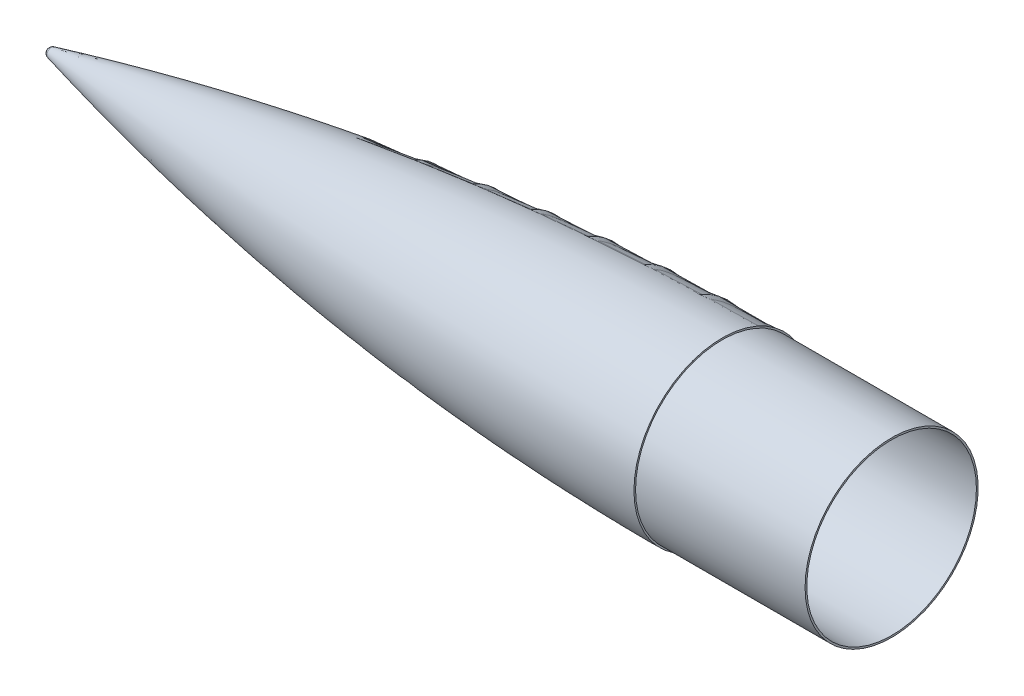
ISO-10303-21;
HEADER;
FILE_DESCRIPTION(('STEP AP214'),'2;1');
FILE_NAME('part.step','',(''),(''),'','','');
FILE_SCHEMA(('AUTOMOTIVE_DESIGN { 1 0 10303 214 1 1 1 1 }'));
ENDSEC;
DATA;
#1=APPLICATION_CONTEXT('core data for automotive mechanical design processes');
#2=APPLICATION_PROTOCOL_DEFINITION('international standard','automotive_design',2000,#1);
#3=PRODUCT_CONTEXT('',#1,'mechanical');
#4=PRODUCT('Part','Part','',(#3));
#5=PRODUCT_RELATED_PRODUCT_CATEGORY('part','',(#4));
#6=PRODUCT_DEFINITION_FORMATION('','',#4);
#7=PRODUCT_DEFINITION_CONTEXT('part definition',#1,'design');
#8=PRODUCT_DEFINITION('design','',#6,#7);
#9=PRODUCT_DEFINITION_SHAPE('','',#8);
#10=(LENGTH_UNIT() NAMED_UNIT(*) SI_UNIT(.MILLI.,.METRE.));
#11=(NAMED_UNIT(*) PLANE_ANGLE_UNIT() SI_UNIT($,.RADIAN.));
#12=(NAMED_UNIT(*) SI_UNIT($,.STERADIAN.) SOLID_ANGLE_UNIT());
#13=UNCERTAINTY_MEASURE_WITH_UNIT(LENGTH_MEASURE(1.E-05),#10,'distance_accuracy_value','');
#14=(GEOMETRIC_REPRESENTATION_CONTEXT(3) GLOBAL_UNCERTAINTY_ASSIGNED_CONTEXT((#13)) GLOBAL_UNIT_ASSIGNED_CONTEXT((#10,
#11,#12)) REPRESENTATION_CONTEXT('',''));
#15=CARTESIAN_POINT('',(0.,0.,0.));
#16=DIRECTION('',(0.,0.,1.));
#17=DIRECTION('',(1.,0.,0.));
#18=AXIS2_PLACEMENT_3D('',#15,#16,#17);
#19=CARTESIAN_POINT('',(8.89281703830846E-10,2.27700670818454E-10,0.));
#20=CARTESIAN_POINT('',(303.115979999935,77.6223999998768,0.));
#21=CARTESIAN_POINT('',(606.231959999011,77.6224,0.));
#22=B_SPLINE_CURVE_WITH_KNOTS('',2,(#19,#20,#21),.UNSPECIFIED.,.F.,.F.,(3,3),
(0.0816098303877607,0.916509984580384),.UNSPECIFIED.);
#23=CARTESIAN_POINT('',(0.,0.,0.));
#24=DIRECTION('',(-1.,0.,0.));
#25=AXIS1_PLACEMENT('',#23,#24);
#26=SURFACE_OF_REVOLUTION('',#22,#25);
#27=CARTESIAN_POINT('',(606.231959999046,0.,0.));
#28=DIRECTION('',(-1.,0.,0.));
#29=DIRECTION('',(0.,0.,1.));
#30=AXIS2_PLACEMENT_3D('',#27,#28,#29);
#31=CIRCLE('',#30,77.6224);
#32=CARTESIAN_POINT('',(606.231959999046,0.,77.6224));
#33=VERTEX_POINT('',#32);
#34=EDGE_CURVE('E54',#33,#33,#31,.T.);
#35=ORIENTED_EDGE('',*,*,#34,.T.);
#36=EDGE_LOOP('',(#35));
#37=FACE_BOUND('',#36,.T.);
#38=CARTESIAN_POINT('',(15.8245263011778,0.,0.));
#39=DIRECTION('',(-1.,0.,0.));
#40=DIRECTION('',(0.,0.,1.));
#41=AXIS2_PLACEMENT_3D('',#38,#39,#40);
#42=CIRCLE('',#41,3.99947903302495);
#43=CARTESIAN_POINT('',(15.8245263011778,0.,3.99947903302495));
#44=VERTEX_POINT('',#43);
#45=EDGE_CURVE('E10',#44,#44,#42,.T.);
#46=ORIENTED_EDGE('',*,*,#45,.F.);
#47=EDGE_LOOP('',(#46));
#48=FACE_BOUND('',#47,.T.);
#49=ADVANCED_FACE('F39',(#37,#48),#26,.F.);
#50=CARTESIAN_POINT('',(16.8219843681021,0.,0.));
#51=DIRECTION('',(-1.,0.,0.));
#52=DIRECTION('',(0.,1.,0.));
#53=AXIS2_PLACEMENT_3D('',#50,#51,#52);
#54=SPHERICAL_SURFACE('',#53,4.12198436810216);
#55=ORIENTED_EDGE('',*,*,#45,.T.);
#56=EDGE_LOOP('',(#55));
#57=FACE_BOUND('',#56,.T.);
#58=ADVANCED_FACE('F101',(#57),#54,.T.);
#59=CARTESIAN_POINT('',(755.456959999046,0.,0.));
#60=DIRECTION('',(1.,0.,0.));
#61=DIRECTION('',(0.,0.,-1.));
#62=AXIS2_PLACEMENT_3D('',#59,#60,#61);
#63=PLANE('',#62);
#64=CARTESIAN_POINT('',(755.456959999046,0.,0.));
#65=DIRECTION('',(1.,0.,0.));
#66=DIRECTION('',(0.,0.,-1.));
#67=AXIS2_PLACEMENT_3D('',#64,#65,#66);
#68=CIRCLE('',#67,74.676);
#69=CARTESIAN_POINT('',(755.456959999046,0.,-74.676));
#70=VERTEX_POINT('',#69);
#71=EDGE_CURVE('E70',#70,#70,#68,.F.);
#72=ORIENTED_EDGE('',*,*,#71,.T.);
#73=EDGE_LOOP('',(#72));
#74=FACE_BOUND('',#73,.T.);
#75=CARTESIAN_POINT('',(755.456959999046,0.,0.));
#76=DIRECTION('',(-1.,0.,0.));
#77=DIRECTION('',(0.,0.,1.));
#78=AXIS2_PLACEMENT_3D('',#75,#76,#77);
#79=CIRCLE('',#78,76.2);
#80=CARTESIAN_POINT('',(755.456959999046,0.,76.2));
#81=VERTEX_POINT('',#80);
#82=EDGE_CURVE('E46',#81,#81,#79,.T.);
#83=ORIENTED_EDGE('',*,*,#82,.F.);
#84=EDGE_LOOP('',(#83));
#85=FACE_BOUND('',#84,.T.);
#86=ADVANCED_FACE('F99',(#74,#85),#63,.T.);
#87=CARTESIAN_POINT('',(0.,0.,0.));
#88=DIRECTION('',(-1.,0.,0.));
#89=DIRECTION('',(0.,0.,1.));
#90=AXIS2_PLACEMENT_3D('',#87,#88,#89);
#91=CYLINDRICAL_SURFACE('',#90,76.2);
#92=ORIENTED_EDGE('',*,*,#82,.T.);
#93=EDGE_LOOP('',(#92));
#94=FACE_BOUND('',#93,.T.);
#95=CARTESIAN_POINT('',(606.231959999046,0.,0.));
#96=DIRECTION('',(-1.,0.,0.));
#97=DIRECTION('',(0.,0.,1.));
#98=AXIS2_PLACEMENT_3D('',#95,#96,#97);
#99=CIRCLE('',#98,76.2);
#100=CARTESIAN_POINT('',(606.231959999046,0.,76.2));
#101=VERTEX_POINT('',#100);
#102=EDGE_CURVE('E50',#101,#101,#99,.T.);
#103=ORIENTED_EDGE('',*,*,#102,.F.);
#104=EDGE_LOOP('',(#103));
#105=FACE_BOUND('',#104,.T.);
#106=ADVANCED_FACE('F95',(#94,#105),#91,.T.);
#107=CARTESIAN_POINT('',(606.231959999046,0.,0.));
#108=DIRECTION('',(1.,0.,0.));
#109=DIRECTION('',(0.,0.,-1.));
#110=AXIS2_PLACEMENT_3D('',#107,#108,#109);
#111=PLANE('',#110);
#112=ORIENTED_EDGE('',*,*,#102,.T.);
#113=EDGE_LOOP('',(#112));
#114=FACE_BOUND('',#113,.T.);
#115=ORIENTED_EDGE('',*,*,#34,.F.);
#116=EDGE_LOOP('',(#115));
#117=FACE_BOUND('',#116,.T.);
#118=ADVANCED_FACE('F92',(#114,#117),#111,.T.);
#119=CARTESIAN_POINT('',(15.8245263011778,3.99947903302496,0.));
#120=CARTESIAN_POINT('',(311.02824315008,77.62239999988,0.));
#121=CARTESIAN_POINT('',(606.231959999011,77.6224,0.));
#122=B_SPLINE_CURVE_WITH_KNOTS('',2,(#119,#120,#121),.UNSPECIFIED.,.F.,.F.,(3,3),
(0.103403302721647,0.916509984580384),.UNSPECIFIED.);
#123=CARTESIAN_POINT('',(0.,0.,0.));
#124=DIRECTION('',(-1.,0.,0.));
#125=AXIS1_PLACEMENT('',#123,#124);
#126=SURFACE_OF_REVOLUTION('',#122,#125);
#127=OFFSET_SURFACE('',#126,1.524,.F.);
#128=CARTESIAN_POINT('',(604.707959999046,0.,0.));
#129=DIRECTION('',(-1.,0.,0.));
#130=DIRECTION('',(0.,0.,1.));
#131=AXIS2_PLACEMENT_3D('',#128,#129,#130);
#132=CIRCLE('',#131,76.0979091384479);
#133=CARTESIAN_POINT('',(604.707959999046,0.,76.0979091384479));
#134=VERTEX_POINT('',#133);
#135=EDGE_CURVE('E168',#134,#134,#132,.T.);
#136=ORIENTED_EDGE('',*,*,#135,.F.);
#137=EDGE_LOOP('',(#136));
#138=FACE_BOUND('',#137,.T.);
#139=CARTESIAN_POINT('',(16.1933113227214,0.,0.));
#140=DIRECTION('',(-1.,0.,0.));
#141=DIRECTION('',(0.,0.,1.));
#142=AXIS2_PLACEMENT_3D('',#139,#140,#141);
#143=CIRCLE('',#142,2.52077229810922);
#144=CARTESIAN_POINT('',(16.1933113227214,0.,2.52077229810922));
#145=VERTEX_POINT('',#144);
#146=EDGE_CURVE('E58',#145,#145,#143,.T.);
#147=ORIENTED_EDGE('',*,*,#146,.T.);
#148=EDGE_LOOP('',(#147));
#149=FACE_BOUND('',#148,.T.);
#150=ADVANCED_FACE('F79',(#138,#149),#127,.T.);
#151=CARTESIAN_POINT('',(16.8219843681021,0.,0.));
#152=DIRECTION('',(-1.,0.,0.));
#153=DIRECTION('',(0.,1.,0.));
#154=AXIS2_PLACEMENT_3D('',#151,#152,#153);
#155=SPHERICAL_SURFACE('',#154,2.59798436810216);
#156=ORIENTED_EDGE('',*,*,#146,.F.);
#157=EDGE_LOOP('',(#156));
#158=FACE_BOUND('',#157,.T.);
#159=ADVANCED_FACE('F80',(#158),#155,.F.);
#160=CARTESIAN_POINT('',(0.,0.,0.));
#161=DIRECTION('',(-1.,0.,0.));
#162=DIRECTION('',(0.,0.,1.));
#163=AXIS2_PLACEMENT_3D('',#160,#161,#162);
#164=CYLINDRICAL_SURFACE('',#163,74.676);
#165=ORIENTED_EDGE('',*,*,#71,.F.);
#166=EDGE_LOOP('',(#165));
#167=FACE_BOUND('',#166,.T.);
#168=CARTESIAN_POINT('',(604.707959999046,0.,0.));
#169=DIRECTION('',(1.,0.,0.));
#170=DIRECTION('',(0.,0.,-1.));
#171=AXIS2_PLACEMENT_3D('',#168,#169,#170);
#172=CIRCLE('',#171,74.676);
#173=CARTESIAN_POINT('',(604.707959999046,0.,-74.676));
#174=VERTEX_POINT('',#173);
#175=EDGE_CURVE('E173',#174,#174,#172,.F.);
#176=ORIENTED_EDGE('',*,*,#175,.T.);
#177=EDGE_LOOP('',(#176));
#178=FACE_BOUND('',#177,.T.);
#179=ADVANCED_FACE('F83',(#167,#178),#164,.F.);
#180=CARTESIAN_POINT('',(604.707959999046,0.,0.));
#181=DIRECTION('',(1.,0.,0.));
#182=DIRECTION('',(0.,0.,-1.));
#183=AXIS2_PLACEMENT_3D('',#180,#181,#182);
#184=PLANE('',#183);
#185=ORIENTED_EDGE('',*,*,#175,.F.);
#186=EDGE_LOOP('',(#185));
#187=FACE_BOUND('',#186,.T.);
#188=ORIENTED_EDGE('',*,*,#135,.T.);
#189=EDGE_LOOP('',(#188));
#190=FACE_BOUND('',#189,.T.);
#191=ADVANCED_FACE('F87',(#187,#190),#184,.F.);
#192=CLOSED_SHELL('',(#49,#58,#86,#106,#118,#150,#159,#179,#191));
#193=MANIFOLD_SOLID_BREP('B2',#192);
#194=ADVANCED_BREP_SHAPE_REPRESENTATION('',(#18,#193),#14);
#195=SHAPE_DEFINITION_REPRESENTATION(#9,#194);
ENDSEC;
END-ISO-10303-21;
